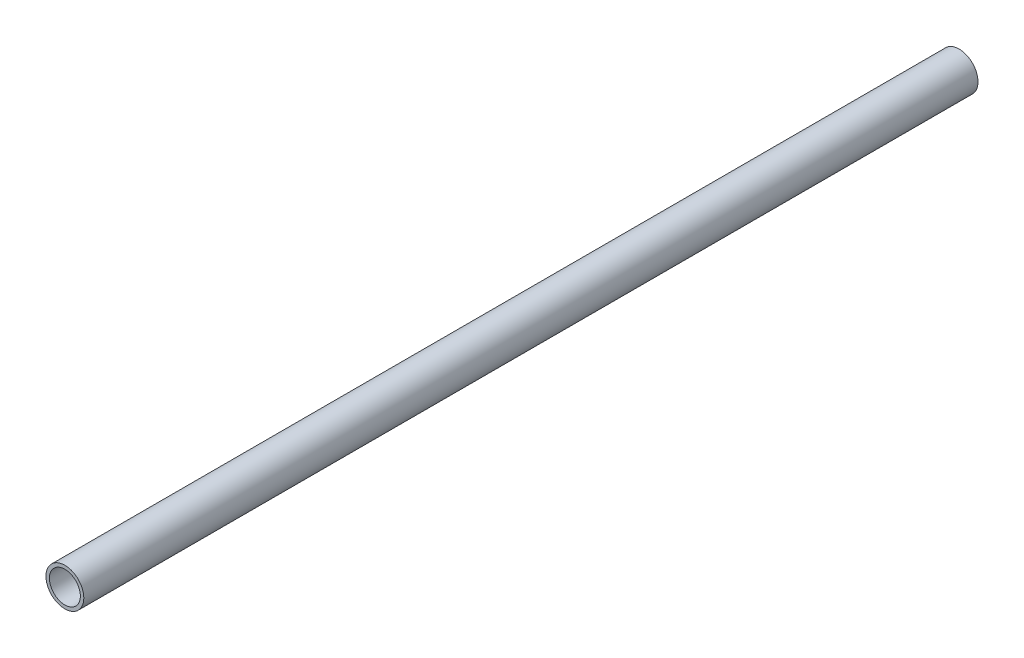
ISO-10303-21;
HEADER;
FILE_DESCRIPTION(('STEP AP214'),'2;1');
FILE_NAME('part.step','',(''),(''),'','','');
FILE_SCHEMA(('AUTOMOTIVE_DESIGN { 1 0 10303 214 1 1 1 1 }'));
ENDSEC;
DATA;
#1=APPLICATION_CONTEXT('core data for automotive mechanical design processes');
#2=APPLICATION_PROTOCOL_DEFINITION('international standard','automotive_design',2000,#1);
#3=PRODUCT_CONTEXT('',#1,'mechanical');
#4=PRODUCT('Part','Part','',(#3));
#5=PRODUCT_RELATED_PRODUCT_CATEGORY('part','',(#4));
#6=PRODUCT_DEFINITION_FORMATION('','',#4);
#7=PRODUCT_DEFINITION_CONTEXT('part definition',#1,'design');
#8=PRODUCT_DEFINITION('design','',#6,#7);
#9=PRODUCT_DEFINITION_SHAPE('','',#8);
#10=(LENGTH_UNIT() NAMED_UNIT(*) SI_UNIT(.MILLI.,.METRE.));
#11=(NAMED_UNIT(*) PLANE_ANGLE_UNIT() SI_UNIT($,.RADIAN.));
#12=(NAMED_UNIT(*) SI_UNIT($,.STERADIAN.) SOLID_ANGLE_UNIT());
#13=UNCERTAINTY_MEASURE_WITH_UNIT(LENGTH_MEASURE(1.E-05),#10,'distance_accuracy_value','');
#14=(GEOMETRIC_REPRESENTATION_CONTEXT(3) GLOBAL_UNCERTAINTY_ASSIGNED_CONTEXT((#13)) GLOBAL_UNIT_ASSIGNED_CONTEXT((#10,
#11,#12)) REPRESENTATION_CONTEXT('',''));
#15=CARTESIAN_POINT('',(0.,0.,0.));
#16=DIRECTION('',(0.,0.,1.));
#17=DIRECTION('',(1.,0.,0.));
#18=AXIS2_PLACEMENT_3D('',#15,#16,#17);
#19=CARTESIAN_POINT('',(0.,0.,520.));
#20=DIRECTION('',(0.,0.,1.));
#21=DIRECTION('',(1.,0.,0.));
#22=AXIS2_PLACEMENT_3D('',#19,#20,#21);
#23=PLANE('',#22);
#24=CARTESIAN_POINT('',(0.,0.,520.));
#25=DIRECTION('',(0.,0.,1.));
#26=DIRECTION('',(1.,0.,0.));
#27=AXIS2_PLACEMENT_3D('',#24,#25,#26);
#28=CIRCLE('',#27,11.);
#29=CARTESIAN_POINT('',(11.,0.,520.));
#30=VERTEX_POINT('',#29);
#31=EDGE_CURVE('E10',#30,#30,#28,.T.);
#32=ORIENTED_EDGE('',*,*,#31,.T.);
#33=EDGE_LOOP('',(#32));
#34=FACE_BOUND('',#33,.T.);
#35=CARTESIAN_POINT('',(0.,0.,520.));
#36=DIRECTION('',(0.,0.,1.));
#37=DIRECTION('',(1.,0.,0.));
#38=AXIS2_PLACEMENT_3D('',#35,#36,#37);
#39=CIRCLE('',#38,9.);
#40=CARTESIAN_POINT('',(9.,0.,520.));
#41=VERTEX_POINT('',#40);
#42=EDGE_CURVE('E49',#41,#41,#39,.T.);
#43=ORIENTED_EDGE('',*,*,#42,.F.);
#44=EDGE_LOOP('',(#43));
#45=FACE_BOUND('',#44,.T.);
#46=ADVANCED_FACE('F39',(#34,#45),#23,.T.);
#47=CARTESIAN_POINT('',(0.,0.,0.));
#48=DIRECTION('',(0.,0.,1.));
#49=DIRECTION('',(1.,0.,0.));
#50=AXIS2_PLACEMENT_3D('',#47,#48,#49);
#51=PLANE('',#50);
#52=CARTESIAN_POINT('',(0.,0.,0.));
#53=DIRECTION('',(0.,0.,1.));
#54=DIRECTION('',(1.,0.,0.));
#55=AXIS2_PLACEMENT_3D('',#52,#53,#54);
#56=CIRCLE('',#55,11.);
#57=CARTESIAN_POINT('',(11.,0.,0.));
#58=VERTEX_POINT('',#57);
#59=EDGE_CURVE('E43',#58,#58,#56,.T.);
#60=ORIENTED_EDGE('',*,*,#59,.F.);
#61=EDGE_LOOP('',(#60));
#62=FACE_BOUND('',#61,.T.);
#63=CARTESIAN_POINT('',(0.,0.,0.));
#64=DIRECTION('',(0.,0.,1.));
#65=DIRECTION('',(1.,0.,0.));
#66=AXIS2_PLACEMENT_3D('',#63,#64,#65);
#67=CIRCLE('',#66,9.);
#68=CARTESIAN_POINT('',(9.,0.,0.));
#69=VERTEX_POINT('',#68);
#70=EDGE_CURVE('E55',#69,#69,#67,.T.);
#71=ORIENTED_EDGE('',*,*,#70,.T.);
#72=EDGE_LOOP('',(#71));
#73=FACE_BOUND('',#72,.T.);
#74=ADVANCED_FACE('F62',(#62,#73),#51,.F.);
#75=CARTESIAN_POINT('',(0.,0.,520.));
#76=DIRECTION('',(0.,0.,-1.));
#77=DIRECTION('',(-1.,0.,0.));
#78=AXIS2_PLACEMENT_3D('',#75,#76,#77);
#79=CYLINDRICAL_SURFACE('',#78,11.);
#80=ORIENTED_EDGE('',*,*,#31,.F.);
#81=EDGE_LOOP('',(#80));
#82=FACE_BOUND('',#81,.T.);
#83=ORIENTED_EDGE('',*,*,#59,.T.);
#84=EDGE_LOOP('',(#83));
#85=FACE_BOUND('',#84,.T.);
#86=ADVANCED_FACE('F41',(#82,#85),#79,.T.);
#87=CARTESIAN_POINT('',(0.,0.,520.));
#88=DIRECTION('',(0.,0.,-1.));
#89=DIRECTION('',(-1.,0.,0.));
#90=AXIS2_PLACEMENT_3D('',#87,#88,#89);
#91=CYLINDRICAL_SURFACE('',#90,9.);
#92=ORIENTED_EDGE('',*,*,#42,.T.);
#93=EDGE_LOOP('',(#92));
#94=FACE_BOUND('',#93,.T.);
#95=ORIENTED_EDGE('',*,*,#70,.F.);
#96=EDGE_LOOP('',(#95));
#97=FACE_BOUND('',#96,.T.);
#98=ADVANCED_FACE('F59',(#94,#97),#91,.F.);
#99=CLOSED_SHELL('',(#46,#74,#86,#98));
#100=MANIFOLD_SOLID_BREP('B2',#99);
#101=ADVANCED_BREP_SHAPE_REPRESENTATION('',(#18,#100),#14);
#102=SHAPE_DEFINITION_REPRESENTATION(#9,#101);
ENDSEC;
END-ISO-10303-21;
